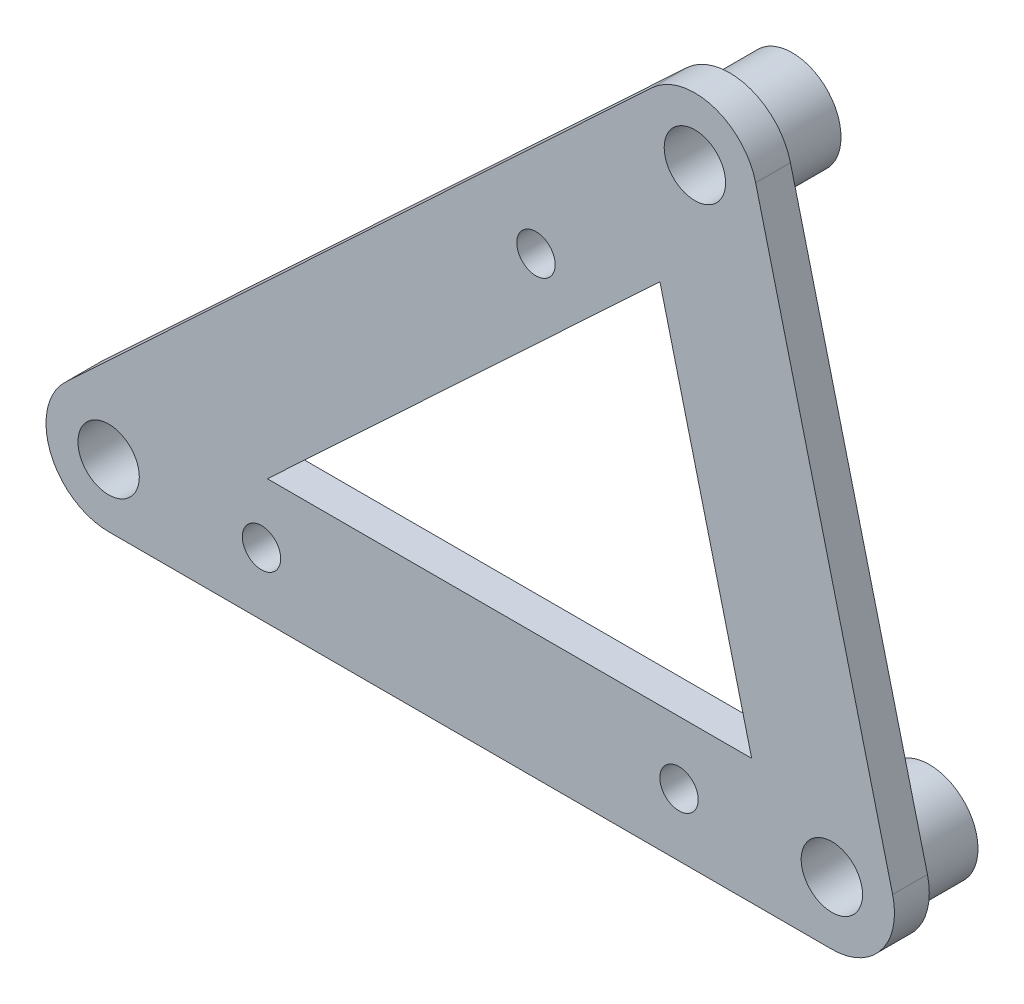
ISO-10303-21;
HEADER;
FILE_DESCRIPTION(('STEP AP214'),'2;1');
FILE_NAME('part.step','',(''),(''),'','','');
FILE_SCHEMA(('AUTOMOTIVE_DESIGN { 1 0 10303 214 1 1 1 1 }'));
ENDSEC;
DATA;
#1=APPLICATION_CONTEXT('core data for automotive mechanical design processes');
#2=APPLICATION_PROTOCOL_DEFINITION('international standard','automotive_design',2000,#1);
#3=PRODUCT_CONTEXT('',#1,'mechanical');
#4=PRODUCT('Part','Part','',(#3));
#5=PRODUCT_RELATED_PRODUCT_CATEGORY('part','',(#4));
#6=PRODUCT_DEFINITION_FORMATION('','',#4);
#7=PRODUCT_DEFINITION_CONTEXT('part definition',#1,'design');
#8=PRODUCT_DEFINITION('design','',#6,#7);
#9=PRODUCT_DEFINITION_SHAPE('','',#8);
#10=(LENGTH_UNIT() NAMED_UNIT(*) SI_UNIT(.MILLI.,.METRE.));
#11=(NAMED_UNIT(*) PLANE_ANGLE_UNIT() SI_UNIT($,.RADIAN.));
#12=(NAMED_UNIT(*) SI_UNIT($,.STERADIAN.) SOLID_ANGLE_UNIT());
#13=UNCERTAINTY_MEASURE_WITH_UNIT(LENGTH_MEASURE(1.E-05),#10,'distance_accuracy_value','');
#14=(GEOMETRIC_REPRESENTATION_CONTEXT(3) GLOBAL_UNCERTAINTY_ASSIGNED_CONTEXT((#13)) GLOBAL_UNIT_ASSIGNED_CONTEXT((#10,
#11,#12)) REPRESENTATION_CONTEXT('',''));
#15=CARTESIAN_POINT('',(0.,0.,0.));
#16=DIRECTION('',(0.,0.,1.));
#17=DIRECTION('',(1.,0.,0.));
#18=AXIS2_PLACEMENT_3D('',#15,#16,#17);
#19=CARTESIAN_POINT('',(-25.5,-59.5,5.715));
#20=DIRECTION('',(0.,0.,-1.));
#21=DIRECTION('',(-1.,0.,0.));
#22=AXIS2_PLACEMENT_3D('',#19,#20,#21);
#23=CYLINDRICAL_SURFACE('',#22,4.445);
#24=CARTESIAN_POINT('',(-25.5,-59.5,0.));
#25=DIRECTION('',(0.,0.,1.));
#26=DIRECTION('',(1.,0.,0.));
#27=AXIS2_PLACEMENT_3D('',#24,#25,#26);
#28=CIRCLE('',#27,4.445);
#29=CARTESIAN_POINT('',(-21.055,-59.5,0.));
#30=VERTEX_POINT('',#29);
#31=EDGE_CURVE('E44',#30,#30,#28,.T.);
#32=ORIENTED_EDGE('',*,*,#31,.T.);
#33=EDGE_LOOP('',(#32));
#34=FACE_BOUND('',#33,.T.);
#35=CARTESIAN_POINT('',(-25.5,-59.5,5.715));
#36=DIRECTION('',(0.,0.,1.));
#37=DIRECTION('',(1.,0.,0.));
#38=AXIS2_PLACEMENT_3D('',#35,#36,#37);
#39=CIRCLE('',#38,4.445);
#40=CARTESIAN_POINT('',(-21.055,-59.5,5.715));
#41=VERTEX_POINT('',#40);
#42=EDGE_CURVE('E11',#41,#41,#39,.T.);
#43=ORIENTED_EDGE('',*,*,#42,.F.);
#44=EDGE_LOOP('',(#43));
#45=FACE_BOUND('',#44,.T.);
#46=ADVANCED_FACE('F35',(#34,#45),#23,.T.);
#47=CARTESIAN_POINT('',(-25.5,-59.5,0.));
#48=DIRECTION('',(0.,0.,1.));
#49=DIRECTION('',(1.,0.,0.));
#50=AXIS2_PLACEMENT_3D('',#47,#48,#49);
#51=PLANE('',#50);
#52=ORIENTED_EDGE('',*,*,#31,.F.);
#53=EDGE_LOOP('',(#52));
#54=FACE_BOUND('',#53,.T.);
#55=CARTESIAN_POINT('',(-25.5,-59.5,0.));
#56=DIRECTION('',(0.,0.,1.));
#57=DIRECTION('',(1.,0.,0.));
#58=AXIS2_PLACEMENT_3D('',#55,#56,#57);
#59=CIRCLE('',#58,2.8);
#60=CARTESIAN_POINT('',(-22.7,-59.5,0.));
#61=VERTEX_POINT('',#60);
#62=EDGE_CURVE('E171',#61,#61,#59,.T.);
#63=ORIENTED_EDGE('',*,*,#62,.T.);
#64=EDGE_LOOP('',(#63));
#65=FACE_BOUND('',#64,.T.);
#66=ADVANCED_FACE('F258',(#54,#65),#51,.F.);
#67=CARTESIAN_POINT('',(-25.5,-59.5,5.715));
#68=DIRECTION('',(0.,0.,-1.));
#69=DIRECTION('',(-1.,0.,0.));
#70=AXIS2_PLACEMENT_3D('',#67,#68,#69);
#71=CYLINDRICAL_SURFACE('',#70,2.8);
#72=ORIENTED_EDGE('',*,*,#62,.F.);
#73=EDGE_LOOP('',(#72));
#74=FACE_BOUND('',#73,.T.);
#75=CARTESIAN_POINT('',(-25.5,-59.5,8.89));
#76=DIRECTION('',(0.,0.,1.));
#77=DIRECTION('',(1.,0.,0.));
#78=AXIS2_PLACEMENT_3D('',#75,#76,#77);
#79=CIRCLE('',#78,2.8);
#80=CARTESIAN_POINT('',(-22.7,-59.5,8.89));
#81=VERTEX_POINT('',#80);
#82=EDGE_CURVE('E168',#81,#81,#79,.F.);
#83=ORIENTED_EDGE('',*,*,#82,.F.);
#84=EDGE_LOOP('',(#83));
#85=FACE_BOUND('',#84,.T.);
#86=ADVANCED_FACE('F263',(#74,#85),#71,.F.);
#87=CARTESIAN_POINT('',(0.,0.,8.89));
#88=DIRECTION('',(0.,0.,1.));
#89=DIRECTION('',(1.,0.,0.));
#90=AXIS2_PLACEMENT_3D('',#87,#88,#89);
#91=PLANE('',#90);
#92=CARTESIAN_POINT('',(-52.5033669427895,-23.7458571377787,8.89));
#93=DIRECTION('',(0.,0.,-1.));
#94=DIRECTION('',(-1.,0.,0.));
#95=AXIS2_PLACEMENT_3D('',#92,#93,#94);
#96=CIRCLE('',#95,1.75000000000001);
#97=CARTESIAN_POINT('',(-54.2533669427896,-23.7458571377787,8.89));
#98=VERTEX_POINT('',#97);
#99=EDGE_CURVE('E188',#98,#98,#96,.T.);
#100=ORIENTED_EDGE('',*,*,#99,.T.);
#101=EDGE_LOOP('',(#100));
#102=FACE_BOUND('',#101,.T.);
#103=CARTESIAN_POINT('',(-77.55,-59.5,8.89));
#104=DIRECTION('',(0.,0.,1.));
#105=DIRECTION('',(1.,0.,0.));
#106=AXIS2_PLACEMENT_3D('',#103,#104,#105);
#107=CIRCLE('',#106,1.75);
#108=CARTESIAN_POINT('',(-75.8,-59.5,8.89));
#109=VERTEX_POINT('',#108);
#110=EDGE_CURVE('E177',#109,#109,#107,.T.);
#111=ORIENTED_EDGE('',*,*,#110,.F.);
#112=EDGE_LOOP('',(#111));
#113=FACE_BOUND('',#112,.T.);
#114=CARTESIAN_POINT('',(-39.45,-59.5,8.89));
#115=DIRECTION('',(0.,0.,1.));
#116=DIRECTION('',(1.,0.,0.));
#117=AXIS2_PLACEMENT_3D('',#114,#115,#116);
#118=CIRCLE('',#117,1.75);
#119=CARTESIAN_POINT('',(-37.7,-59.5,8.89));
#120=VERTEX_POINT('',#119);
#121=EDGE_CURVE('E183',#120,#120,#118,.T.);
#122=ORIENTED_EDGE('',*,*,#121,.F.);
#123=EDGE_LOOP('',(#122));
#124=FACE_BOUND('',#123,.T.);
#125=ORIENTED_EDGE('',*,*,#82,.T.);
#126=EDGE_LOOP('',(#125));
#127=FACE_BOUND('',#126,.T.);
#128=DIRECTION('',(-0.242535625036333,0.970142500145332,0.));
#129=VECTOR('',#128,1.);
#130=CARTESIAN_POINT('',(-43.5443643883306,-10.8860910970827,8.89));
#131=LINE('',#130,#129);
#132=CARTESIAN_POINT('',(-32.8196371626012,-53.785,8.89));
#133=VERTEX_POINT('',#132);
#134=CARTESIAN_POINT('',(-41.1899823642551,-20.3036191933847,8.89));
#135=VERTEX_POINT('',#134);
#136=EDGE_CURVE('E200',#133,#135,#131,.T.);
#137=ORIENTED_EDGE('',*,*,#136,.F.);
#138=DIRECTION('',(-1.,0.,0.));
#139=VECTOR('',#138,1.);
#140=CARTESIAN_POINT('',(0.,-53.785,8.89));
#141=LINE('',#140,#139);
#142=CARTESIAN_POINT('',(-77.0150598273334,-53.785,8.89));
#143=VERTEX_POINT('',#142);
#144=EDGE_CURVE('E202',#133,#143,#141,.T.);
#145=ORIENTED_EDGE('',*,*,#144,.T.);
#146=DIRECTION('',(-0.730600984463314,-0.68280465837693,0.));
#147=VECTOR('',#146,1.);
#148=CARTESIAN_POINT('',(-9.07506635616276,9.71032100109414,8.89));
#149=LINE('',#148,#147);
#150=EDGE_CURVE('E204',#135,#143,#149,.T.);
#151=ORIENTED_EDGE('',*,*,#150,.F.);
#152=EDGE_LOOP('',(#137,#145,#151));
#153=FACE_BOUND('',#152,.T.);
#154=DIRECTION('',(-1.,0.,0.));
#155=VECTOR('',#154,1.);
#156=CARTESIAN_POINT('',(0.,-65.215,8.89));
#157=LINE('',#156,#155);
#158=CARTESIAN_POINT('',(-25.5,-65.215,8.89));
#159=VERTEX_POINT('',#158);
#160=CARTESIAN_POINT('',(-91.5,-65.215,8.89));
#161=VERTEX_POINT('',#160);
#162=EDGE_CURVE('E207',#159,#161,#157,.T.);
#163=ORIENTED_EDGE('',*,*,#162,.F.);
#164=CARTESIAN_POINT('',(-25.5,-59.5,8.89));
#165=DIRECTION('',(0.,0.,1.));
#166=DIRECTION('',(1.,0.,0.));
#167=AXIS2_PLACEMENT_3D('',#164,#165,#166);
#168=CIRCLE('',#167,5.715);
#169=CARTESIAN_POINT('',(-19.9556356116694,-58.1139089029174,8.89));
#170=VERTEX_POINT('',#169);
#171=EDGE_CURVE('E209',#159,#170,#168,.T.);
#172=ORIENTED_EDGE('',*,*,#171,.T.);
#173=DIRECTION('',(-0.242535625036333,0.970142500145332,0.));
#174=VECTOR('',#173,1.);
#175=CARTESIAN_POINT('',(-32.4556356116694,-8.11390890291736,8.89));
#176=LINE('',#175,#174);
#177=CARTESIAN_POINT('',(-32.4556356116694,-8.11390890291735,8.89));
#178=VERTEX_POINT('',#177);
#179=EDGE_CURVE('E132',#170,#178,#176,.T.);
#180=ORIENTED_EDGE('',*,*,#179,.T.);
#181=CARTESIAN_POINT('',(-38.,-9.49999999999999,8.89));
#182=DIRECTION('',(0.,0.,1.));
#183=DIRECTION('',(1.,0.,0.));
#184=AXIS2_PLACEMENT_3D('',#181,#182,#183);
#185=CIRCLE('',#184,5.715);
#186=CARTESIAN_POINT('',(-41.9022286226242,-5.32461537379216,8.89));
#187=VERTEX_POINT('',#186);
#188=EDGE_CURVE('E126',#178,#187,#185,.T.);
#189=ORIENTED_EDGE('',*,*,#188,.T.);
#190=DIRECTION('',(-0.730600984463315,-0.682804658376929,0.));
#191=VECTOR('',#190,1.);
#192=CARTESIAN_POINT('',(-16.879523601411,18.0610902535098,8.89));
#193=LINE('',#192,#191);
#194=CARTESIAN_POINT('',(-95.4022286226241,-55.3246153737921,8.89));
#195=VERTEX_POINT('',#194);
#196=EDGE_CURVE('E118',#187,#195,#193,.T.);
#197=ORIENTED_EDGE('',*,*,#196,.T.);
#198=CARTESIAN_POINT('',(-91.5,-59.5,8.89));
#199=DIRECTION('',(0.,0.,1.));
#200=DIRECTION('',(1.,0.,0.));
#201=AXIS2_PLACEMENT_3D('',#198,#199,#200);
#202=CIRCLE('',#201,5.71499999999999);
#203=EDGE_CURVE('E53',#195,#161,#202,.T.);
#204=ORIENTED_EDGE('',*,*,#203,.T.);
#205=EDGE_LOOP('',(#163,#172,#180,#189,#197,#204));
#206=FACE_BOUND('',#205,.T.);
#207=CARTESIAN_POINT('',(-38.,-9.49999999999999,8.89));
#208=DIRECTION('',(0.,0.,1.));
#209=DIRECTION('',(1.,0.,0.));
#210=AXIS2_PLACEMENT_3D('',#207,#208,#209);
#211=CIRCLE('',#210,2.8);
#212=CARTESIAN_POINT('',(-40.8,-9.49999999999999,8.89));
#213=VERTEX_POINT('',#212);
#214=EDGE_CURVE('E213',#213,#213,#211,.T.);
#215=ORIENTED_EDGE('',*,*,#214,.F.);
#216=EDGE_LOOP('',(#215));
#217=FACE_BOUND('',#216,.T.);
#218=CARTESIAN_POINT('',(-91.5,-59.5,8.89));
#219=DIRECTION('',(0.,0.,1.));
#220=DIRECTION('',(1.,0.,0.));
#221=AXIS2_PLACEMENT_3D('',#218,#219,#220);
#222=CIRCLE('',#221,2.8);
#223=CARTESIAN_POINT('',(-88.7,-59.5,8.89));
#224=VERTEX_POINT('',#223);
#225=EDGE_CURVE('E154',#224,#224,#222,.T.);
#226=ORIENTED_EDGE('',*,*,#225,.F.);
#227=EDGE_LOOP('',(#226));
#228=FACE_BOUND('',#227,.T.);
#229=ADVANCED_FACE('F129',(#102,#113,#124,#127,#153,#206,#217,#228),#91,.T.);
#230=CARTESIAN_POINT('',(0.,0.,5.715));
#231=DIRECTION('',(0.,0.,1.));
#232=DIRECTION('',(1.,0.,0.));
#233=AXIS2_PLACEMENT_3D('',#230,#231,#232);
#234=PLANE('',#233);
#235=CARTESIAN_POINT('',(-52.5033669427895,-23.7458571377787,5.715));
#236=DIRECTION('',(0.,0.,-1.));
#237=DIRECTION('',(-1.,0.,0.));
#238=AXIS2_PLACEMENT_3D('',#235,#236,#237);
#239=CIRCLE('',#238,1.75000000000001);
#240=CARTESIAN_POINT('',(-54.2533669427896,-23.7458571377787,5.715));
#241=VERTEX_POINT('',#240);
#242=EDGE_CURVE('E191',#241,#241,#239,.T.);
#243=ORIENTED_EDGE('',*,*,#242,.F.);
#244=EDGE_LOOP('',(#243));
#245=FACE_BOUND('',#244,.T.);
#246=CARTESIAN_POINT('',(-77.55,-59.5,5.715));
#247=DIRECTION('',(0.,0.,1.));
#248=DIRECTION('',(1.,0.,0.));
#249=AXIS2_PLACEMENT_3D('',#246,#247,#248);
#250=CIRCLE('',#249,1.75);
#251=CARTESIAN_POINT('',(-75.8,-59.5,5.715));
#252=VERTEX_POINT('',#251);
#253=EDGE_CURVE('E38',#252,#252,#250,.T.);
#254=ORIENTED_EDGE('',*,*,#253,.T.);
#255=EDGE_LOOP('',(#254));
#256=FACE_BOUND('',#255,.T.);
#257=CARTESIAN_POINT('',(-39.45,-59.5,5.715));
#258=DIRECTION('',(0.,0.,1.));
#259=DIRECTION('',(1.,0.,0.));
#260=AXIS2_PLACEMENT_3D('',#257,#258,#259);
#261=CIRCLE('',#260,1.75);
#262=CARTESIAN_POINT('',(-37.7,-59.5,5.715));
#263=VERTEX_POINT('',#262);
#264=EDGE_CURVE('E175',#263,#263,#261,.T.);
#265=ORIENTED_EDGE('',*,*,#264,.T.);
#266=EDGE_LOOP('',(#265));
#267=FACE_BOUND('',#266,.T.);
#268=ORIENTED_EDGE('',*,*,#42,.T.);
#269=EDGE_LOOP('',(#268));
#270=FACE_BOUND('',#269,.T.);
#271=DIRECTION('',(-1.,0.,0.));
#272=VECTOR('',#271,1.);
#273=CARTESIAN_POINT('',(0.,-65.215,5.715));
#274=LINE('',#273,#272);
#275=CARTESIAN_POINT('',(-25.5,-65.215,5.715));
#276=VERTEX_POINT('',#275);
#277=CARTESIAN_POINT('',(-91.5,-65.215,5.715));
#278=VERTEX_POINT('',#277);
#279=EDGE_CURVE('E226',#276,#278,#274,.T.);
#280=ORIENTED_EDGE('',*,*,#279,.T.);
#281=CARTESIAN_POINT('',(-91.5,-59.5,5.715));
#282=DIRECTION('',(0.,0.,1.));
#283=DIRECTION('',(1.,0.,0.));
#284=AXIS2_PLACEMENT_3D('',#281,#282,#283);
#285=CIRCLE('',#284,5.71499999999999);
#286=CARTESIAN_POINT('',(-95.4022286226241,-55.3246153737921,5.715));
#287=VERTEX_POINT('',#286);
#288=EDGE_CURVE('E84',#287,#278,#285,.T.);
#289=ORIENTED_EDGE('',*,*,#288,.F.);
#290=DIRECTION('',(-0.730600984463315,-0.682804658376929,0.));
#291=VECTOR('',#290,1.);
#292=CARTESIAN_POINT('',(-16.879523601411,18.0610902535098,5.715));
#293=LINE('',#292,#291);
#294=CARTESIAN_POINT('',(-41.9022286226242,-5.32461537379216,5.715));
#295=VERTEX_POINT('',#294);
#296=EDGE_CURVE('E235',#295,#287,#293,.T.);
#297=ORIENTED_EDGE('',*,*,#296,.F.);
#298=CARTESIAN_POINT('',(-38.,-9.49999999999999,5.715));
#299=DIRECTION('',(0.,0.,1.));
#300=DIRECTION('',(1.,0.,0.));
#301=AXIS2_PLACEMENT_3D('',#298,#299,#300);
#302=CIRCLE('',#301,5.715);
#303=CARTESIAN_POINT('',(-32.4556356116694,-8.11390890291735,5.715));
#304=VERTEX_POINT('',#303);
#305=EDGE_CURVE('E138',#304,#295,#302,.T.);
#306=ORIENTED_EDGE('',*,*,#305,.F.);
#307=DIRECTION('',(-0.242535625036333,0.970142500145332,0.));
#308=VECTOR('',#307,1.);
#309=CARTESIAN_POINT('',(-32.4556356116694,-8.11390890291736,5.715));
#310=LINE('',#309,#308);
#311=CARTESIAN_POINT('',(-19.9556356116694,-58.1139089029174,5.715));
#312=VERTEX_POINT('',#311);
#313=EDGE_CURVE('E231',#312,#304,#310,.T.);
#314=ORIENTED_EDGE('',*,*,#313,.F.);
#315=CARTESIAN_POINT('',(-25.5,-59.5,5.715));
#316=DIRECTION('',(0.,0.,1.));
#317=DIRECTION('',(1.,0.,0.));
#318=AXIS2_PLACEMENT_3D('',#315,#316,#317);
#319=CIRCLE('',#318,5.715);
#320=EDGE_CURVE('E228',#276,#312,#319,.T.);
#321=ORIENTED_EDGE('',*,*,#320,.F.);
#322=EDGE_LOOP('',(#280,#289,#297,#306,#314,#321));
#323=FACE_BOUND('',#322,.T.);
#324=DIRECTION('',(-0.242535625036333,0.970142500145332,0.));
#325=VECTOR('',#324,1.);
#326=CARTESIAN_POINT('',(-43.5443643883306,-10.8860910970827,5.715));
#327=LINE('',#326,#325);
#328=CARTESIAN_POINT('',(-32.8196371626012,-53.785,5.715));
#329=VERTEX_POINT('',#328);
#330=CARTESIAN_POINT('',(-41.1899823642551,-20.3036191933847,5.715));
#331=VERTEX_POINT('',#330);
#332=EDGE_CURVE('E199',#329,#331,#327,.T.);
#333=ORIENTED_EDGE('',*,*,#332,.T.);
#334=DIRECTION('',(-0.730600984463314,-0.68280465837693,0.));
#335=VECTOR('',#334,1.);
#336=CARTESIAN_POINT('',(-9.07506635616276,9.71032100109414,5.715));
#337=LINE('',#336,#335);
#338=CARTESIAN_POINT('',(-77.0150598273334,-53.785,5.715));
#339=VERTEX_POINT('',#338);
#340=EDGE_CURVE('E223',#331,#339,#337,.T.);
#341=ORIENTED_EDGE('',*,*,#340,.T.);
#342=DIRECTION('',(-1.,0.,0.));
#343=VECTOR('',#342,1.);
#344=CARTESIAN_POINT('',(0.,-53.785,5.715));
#345=LINE('',#344,#343);
#346=EDGE_CURVE('E220',#329,#339,#345,.T.);
#347=ORIENTED_EDGE('',*,*,#346,.F.);
#348=EDGE_LOOP('',(#333,#341,#347));
#349=FACE_BOUND('',#348,.T.);
#350=CARTESIAN_POINT('',(-91.5,-59.5,5.715));
#351=DIRECTION('',(0.,0.,1.));
#352=DIRECTION('',(1.,0.,0.));
#353=AXIS2_PLACEMENT_3D('',#350,#351,#352);
#354=CIRCLE('',#353,4.445);
#355=CARTESIAN_POINT('',(-87.055,-59.5,5.715));
#356=VERTEX_POINT('',#355);
#357=EDGE_CURVE('E160',#356,#356,#354,.T.);
#358=ORIENTED_EDGE('',*,*,#357,.T.);
#359=EDGE_LOOP('',(#358));
#360=FACE_BOUND('',#359,.T.);
#361=CARTESIAN_POINT('',(-38.,-9.49999999999999,5.715));
#362=DIRECTION('',(0.,0.,1.));
#363=DIRECTION('',(1.,0.,0.));
#364=AXIS2_PLACEMENT_3D('',#361,#362,#363);
#365=CIRCLE('',#364,4.445);
#366=CARTESIAN_POINT('',(-33.555,-9.49999999999999,5.715));
#367=VERTEX_POINT('',#366);
#368=EDGE_CURVE('E163',#367,#367,#365,.F.);
#369=ORIENTED_EDGE('',*,*,#368,.F.);
#370=EDGE_LOOP('',(#369));
#371=FACE_BOUND('',#370,.T.);
#372=ADVANCED_FACE('F240',(#245,#256,#267,#270,#323,#349,#360,#371),#234,.F.);
#373=CARTESIAN_POINT('',(-91.5,-59.5,0.));
#374=DIRECTION('',(0.,0.,1.));
#375=DIRECTION('',(1.,0.,0.));
#376=AXIS2_PLACEMENT_3D('',#373,#374,#375);
#377=PLANE('',#376);
#378=CARTESIAN_POINT('',(-91.5,-59.5,0.));
#379=DIRECTION('',(0.,0.,1.));
#380=DIRECTION('',(1.,0.,0.));
#381=AXIS2_PLACEMENT_3D('',#378,#379,#380);
#382=CIRCLE('',#381,4.445);
#383=CARTESIAN_POINT('',(-87.055,-59.5,0.));
#384=VERTEX_POINT('',#383);
#385=EDGE_CURVE('E159',#384,#384,#382,.T.);
#386=ORIENTED_EDGE('',*,*,#385,.F.);
#387=EDGE_LOOP('',(#386));
#388=FACE_BOUND('',#387,.T.);
#389=CARTESIAN_POINT('',(-91.5,-59.5,0.));
#390=DIRECTION('',(0.,0.,1.));
#391=DIRECTION('',(1.,0.,0.));
#392=AXIS2_PLACEMENT_3D('',#389,#390,#391);
#393=CIRCLE('',#392,2.79999999999999);
#394=CARTESIAN_POINT('',(-88.7,-59.5,0.));
#395=VERTEX_POINT('',#394);
#396=EDGE_CURVE('E150',#395,#395,#393,.T.);
#397=ORIENTED_EDGE('',*,*,#396,.T.);
#398=EDGE_LOOP('',(#397));
#399=FACE_BOUND('',#398,.T.);
#400=ADVANCED_FACE('F270',(#388,#399),#377,.F.);
#401=CARTESIAN_POINT('',(-91.5,-59.5,5.715));
#402=DIRECTION('',(0.,0.,-1.));
#403=DIRECTION('',(-1.,0.,0.));
#404=AXIS2_PLACEMENT_3D('',#401,#402,#403);
#405=CYLINDRICAL_SURFACE('',#404,4.445);
#406=ORIENTED_EDGE('',*,*,#357,.F.);
#407=EDGE_LOOP('',(#406));
#408=FACE_BOUND('',#407,.T.);
#409=ORIENTED_EDGE('',*,*,#385,.T.);
#410=EDGE_LOOP('',(#409));
#411=FACE_BOUND('',#410,.T.);
#412=ADVANCED_FACE('F278',(#408,#411),#405,.T.);
#413=CARTESIAN_POINT('',(-91.5,-59.5,5.715));
#414=DIRECTION('',(0.,0.,-1.));
#415=DIRECTION('',(-1.,0.,0.));
#416=AXIS2_PLACEMENT_3D('',#413,#414,#415);
#417=CYLINDRICAL_SURFACE('',#416,2.79999999999999);
#418=ORIENTED_EDGE('',*,*,#396,.F.);
#419=EDGE_LOOP('',(#418));
#420=FACE_BOUND('',#419,.T.);
#421=ORIENTED_EDGE('',*,*,#225,.T.);
#422=EDGE_LOOP('',(#421));
#423=FACE_BOUND('',#422,.T.);
#424=ADVANCED_FACE('F310',(#420,#423),#417,.F.);
#425=CARTESIAN_POINT('',(0.,-65.215,8.89));
#426=DIRECTION('',(0.,-1.,0.));
#427=DIRECTION('',(0.,0.,-1.));
#428=AXIS2_PLACEMENT_3D('',#425,#426,#427);
#429=PLANE('',#428);
#430=ORIENTED_EDGE('',*,*,#279,.F.);
#431=DIRECTION('',(0.,0.,-1.));
#432=VECTOR('',#431,1.);
#433=CARTESIAN_POINT('',(-25.5,-65.215,8.89));
#434=LINE('',#433,#432);
#435=EDGE_CURVE('E148',#159,#276,#434,.T.);
#436=ORIENTED_EDGE('',*,*,#435,.F.);
#437=ORIENTED_EDGE('',*,*,#162,.T.);
#438=DIRECTION('',(0.,0.,-1.));
#439=VECTOR('',#438,1.);
#440=CARTESIAN_POINT('',(-91.5,-65.215,8.89));
#441=LINE('',#440,#439);
#442=EDGE_CURVE('E91',#161,#278,#441,.T.);
#443=ORIENTED_EDGE('',*,*,#442,.T.);
#444=EDGE_LOOP('',(#430,#436,#437,#443));
#445=FACE_BOUND('',#444,.T.);
#446=ADVANCED_FACE('F242',(#445),#429,.T.);
#447=CARTESIAN_POINT('',(-25.5,-59.5,8.89));
#448=DIRECTION('',(0.,0.,-1.));
#449=DIRECTION('',(-1.,0.,0.));
#450=AXIS2_PLACEMENT_3D('',#447,#448,#449);
#451=CYLINDRICAL_SURFACE('',#450,5.715);
#452=ORIENTED_EDGE('',*,*,#320,.T.);
#453=DIRECTION('',(0.,0.,-1.));
#454=VECTOR('',#453,1.);
#455=CARTESIAN_POINT('',(-19.9556356116694,-58.1139089029174,8.89));
#456=LINE('',#455,#454);
#457=EDGE_CURVE('E141',#170,#312,#456,.T.);
#458=ORIENTED_EDGE('',*,*,#457,.F.);
#459=ORIENTED_EDGE('',*,*,#171,.F.);
#460=ORIENTED_EDGE('',*,*,#435,.T.);
#461=EDGE_LOOP('',(#452,#458,#459,#460));
#462=FACE_BOUND('',#461,.T.);
#463=ADVANCED_FACE('F246',(#462),#451,.T.);
#464=CARTESIAN_POINT('',(-32.4556356116694,-8.11390890291736,8.89));
#465=DIRECTION('',(-0.970142500145332,-0.242535625036333,0.));
#466=DIRECTION('',(0.242535625036333,-0.970142500145332,0.));
#467=AXIS2_PLACEMENT_3D('',#464,#465,#466);
#468=PLANE('',#467);
#469=ORIENTED_EDGE('',*,*,#313,.T.);
#470=DIRECTION('',(0.,0.,-1.));
#471=VECTOR('',#470,1.);
#472=CARTESIAN_POINT('',(-32.4556356116694,-8.11390890291735,8.89));
#473=LINE('',#472,#471);
#474=EDGE_CURVE('E139',#178,#304,#473,.T.);
#475=ORIENTED_EDGE('',*,*,#474,.F.);
#476=ORIENTED_EDGE('',*,*,#179,.F.);
#477=ORIENTED_EDGE('',*,*,#457,.T.);
#478=EDGE_LOOP('',(#469,#475,#476,#477));
#479=FACE_BOUND('',#478,.T.);
#480=ADVANCED_FACE('F248',(#479),#468,.F.);
#481=CARTESIAN_POINT('',(-38.,-9.49999999999999,8.89));
#482=DIRECTION('',(0.,0.,-1.));
#483=DIRECTION('',(-1.,0.,0.));
#484=AXIS2_PLACEMENT_3D('',#481,#482,#483);
#485=CYLINDRICAL_SURFACE('',#484,5.715);
#486=ORIENTED_EDGE('',*,*,#305,.T.);
#487=DIRECTION('',(0.,0.,-1.));
#488=VECTOR('',#487,1.);
#489=CARTESIAN_POINT('',(-41.9022286226242,-5.32461537379216,8.89));
#490=LINE('',#489,#488);
#491=EDGE_CURVE('E123',#187,#295,#490,.T.);
#492=ORIENTED_EDGE('',*,*,#491,.F.);
#493=ORIENTED_EDGE('',*,*,#188,.F.);
#494=ORIENTED_EDGE('',*,*,#474,.T.);
#495=EDGE_LOOP('',(#486,#492,#493,#494));
#496=FACE_BOUND('',#495,.T.);
#497=ADVANCED_FACE('F137',(#496),#485,.T.);
#498=CARTESIAN_POINT('',(-16.879523601411,18.0610902535098,8.89));
#499=DIRECTION('',(0.682804658376929,-0.730600984463315,0.));
#500=DIRECTION('',(0.730600984463315,0.682804658376929,0.));
#501=AXIS2_PLACEMENT_3D('',#498,#499,#500);
#502=PLANE('',#501);
#503=ORIENTED_EDGE('',*,*,#296,.T.);
#504=DIRECTION('',(0.,0.,-1.));
#505=VECTOR('',#504,1.);
#506=CARTESIAN_POINT('',(-95.4022286226241,-55.3246153737921,8.89));
#507=LINE('',#506,#505);
#508=EDGE_CURVE('E125',#195,#287,#507,.T.);
#509=ORIENTED_EDGE('',*,*,#508,.F.);
#510=ORIENTED_EDGE('',*,*,#196,.F.);
#511=ORIENTED_EDGE('',*,*,#491,.T.);
#512=EDGE_LOOP('',(#503,#509,#510,#511));
#513=FACE_BOUND('',#512,.T.);
#514=ADVANCED_FACE('F121',(#513),#502,.F.);
#515=CARTESIAN_POINT('',(-43.5443643883306,-10.8860910970827,8.89));
#516=DIRECTION('',(-0.970142500145332,-0.242535625036333,0.));
#517=DIRECTION('',(0.242535625036333,-0.970142500145332,0.));
#518=AXIS2_PLACEMENT_3D('',#515,#516,#517);
#519=PLANE('',#518);
#520=ORIENTED_EDGE('',*,*,#332,.F.);
#521=DIRECTION('',(0.,0.,-1.));
#522=VECTOR('',#521,1.);
#523=CARTESIAN_POINT('',(-32.8196371626012,-53.785,8.89));
#524=LINE('',#523,#522);
#525=EDGE_CURVE('E98',#133,#329,#524,.T.);
#526=ORIENTED_EDGE('',*,*,#525,.F.);
#527=ORIENTED_EDGE('',*,*,#136,.T.);
#528=DIRECTION('',(0.,0.,-1.));
#529=VECTOR('',#528,1.);
#530=CARTESIAN_POINT('',(-41.1899823642551,-20.3036191933847,8.89));
#531=LINE('',#530,#529);
#532=EDGE_CURVE('E151',#135,#331,#531,.T.);
#533=ORIENTED_EDGE('',*,*,#532,.T.);
#534=EDGE_LOOP('',(#520,#526,#527,#533));
#535=FACE_BOUND('',#534,.T.);
#536=ADVANCED_FACE('F298',(#535),#519,.T.);
#537=CARTESIAN_POINT('',(0.,-53.785,8.89));
#538=DIRECTION('',(0.,-1.,0.));
#539=DIRECTION('',(1.,0.,0.));
#540=AXIS2_PLACEMENT_3D('',#537,#538,#539);
#541=PLANE('',#540);
#542=ORIENTED_EDGE('',*,*,#346,.T.);
#543=DIRECTION('',(0.,0.,-1.));
#544=VECTOR('',#543,1.);
#545=CARTESIAN_POINT('',(-77.0150598273334,-53.785,8.89));
#546=LINE('',#545,#544);
#547=EDGE_CURVE('E153',#143,#339,#546,.T.);
#548=ORIENTED_EDGE('',*,*,#547,.F.);
#549=ORIENTED_EDGE('',*,*,#144,.F.);
#550=ORIENTED_EDGE('',*,*,#525,.T.);
#551=EDGE_LOOP('',(#542,#548,#549,#550));
#552=FACE_BOUND('',#551,.T.);
#553=ADVANCED_FACE('F292',(#552),#541,.F.);
#554=CARTESIAN_POINT('',(-38.,-9.49999999999999,8.89));
#555=DIRECTION('',(0.,0.,-1.));
#556=DIRECTION('',(-1.,0.,0.));
#557=AXIS2_PLACEMENT_3D('',#554,#555,#556);
#558=CYLINDRICAL_SURFACE('',#557,2.8);
#559=CARTESIAN_POINT('',(-38.,-9.49999999999999,0.));
#560=DIRECTION('',(0.,0.,1.));
#561=DIRECTION('',(1.,0.,0.));
#562=AXIS2_PLACEMENT_3D('',#559,#560,#561);
#563=CIRCLE('',#562,2.8);
#564=CARTESIAN_POINT('',(-40.8,-9.49999999999999,0.));
#565=VERTEX_POINT('',#564);
#566=EDGE_CURVE('E181',#565,#565,#563,.T.);
#567=CARTESIAN_POINT('',(-40.8,-9.49999999999999,8.89));
#568=CARTESIAN_POINT('',(-40.8,-9.49999999999999,8.79739583333333));
#569=CARTESIAN_POINT('',(-40.8,-9.49999999999999,8.70479166666667));
#570=CARTESIAN_POINT('',(-40.8,-9.49999999999999,8.51958333333333));
#571=CARTESIAN_POINT('',(-40.8,-9.49999999999999,8.42697916666667));
#572=CARTESIAN_POINT('',(-40.8,-9.49999999999999,8.24177083333333));
#573=CARTESIAN_POINT('',(-40.8,-9.49999999999999,8.14916666666667));
#574=CARTESIAN_POINT('',(-40.8,-9.49999999999999,7.96395833333333));
#575=CARTESIAN_POINT('',(-40.8,-9.49999999999999,7.87135416666667));
#576=CARTESIAN_POINT('',(-40.8,-9.49999999999999,7.68614583333333));
#577=CARTESIAN_POINT('',(-40.8,-9.49999999999999,7.59354166666667));
#578=CARTESIAN_POINT('',(-40.8,-9.49999999999999,7.40833333333333));
#579=CARTESIAN_POINT('',(-40.8,-9.49999999999999,7.31572916666667));
#580=CARTESIAN_POINT('',(-40.8,-9.49999999999999,7.13052083333333));
#581=CARTESIAN_POINT('',(-40.8,-9.49999999999999,7.03791666666667));
#582=CARTESIAN_POINT('',(-40.8,-9.49999999999999,6.85270833333333));
#583=CARTESIAN_POINT('',(-40.8,-9.49999999999999,6.76010416666667));
#584=CARTESIAN_POINT('',(-40.8,-9.49999999999999,6.57489583333333));
#585=CARTESIAN_POINT('',(-40.8,-9.49999999999999,6.48229166666667));
#586=CARTESIAN_POINT('',(-40.8,-9.49999999999999,6.29708333333333));
#587=CARTESIAN_POINT('',(-40.8,-9.49999999999999,6.20447916666667));
#588=CARTESIAN_POINT('',(-40.8,-9.49999999999999,6.01927083333333));
#589=CARTESIAN_POINT('',(-40.8,-9.49999999999999,5.92666666666667));
#590=CARTESIAN_POINT('',(-40.8,-9.49999999999999,5.74145833333333));
#591=CARTESIAN_POINT('',(-40.8,-9.49999999999999,5.64885416666667));
#592=CARTESIAN_POINT('',(-40.8,-9.49999999999999,5.46364583333333));
#593=CARTESIAN_POINT('',(-40.8,-9.49999999999999,5.37104166666667));
#594=CARTESIAN_POINT('',(-40.8,-9.49999999999999,5.18583333333333));
#595=CARTESIAN_POINT('',(-40.8,-9.49999999999999,5.09322916666667));
#596=CARTESIAN_POINT('',(-40.8,-9.49999999999999,4.90802083333333));
#597=CARTESIAN_POINT('',(-40.8,-9.49999999999999,4.81541666666667));
#598=CARTESIAN_POINT('',(-40.8,-9.49999999999999,4.63020833333333));
#599=CARTESIAN_POINT('',(-40.8,-9.49999999999999,4.53760416666667));
#600=CARTESIAN_POINT('',(-40.8,-9.49999999999999,4.35239583333333));
#601=CARTESIAN_POINT('',(-40.8,-9.49999999999999,4.25979166666667));
#602=CARTESIAN_POINT('',(-40.8,-9.49999999999999,4.07458333333333));
#603=CARTESIAN_POINT('',(-40.8,-9.49999999999999,3.98197916666667));
#604=CARTESIAN_POINT('',(-40.8,-9.49999999999999,3.79677083333333));
#605=CARTESIAN_POINT('',(-40.8,-9.49999999999999,3.70416666666667));
#606=CARTESIAN_POINT('',(-40.8,-9.49999999999999,3.51895833333333));
#607=CARTESIAN_POINT('',(-40.8,-9.49999999999999,3.42635416666667));
#608=CARTESIAN_POINT('',(-40.8,-9.49999999999999,3.24114583333333));
#609=CARTESIAN_POINT('',(-40.8,-9.49999999999999,3.14854166666667));
#610=CARTESIAN_POINT('',(-40.8,-9.49999999999999,2.96333333333333));
#611=CARTESIAN_POINT('',(-40.8,-9.49999999999999,2.87072916666667));
#612=CARTESIAN_POINT('',(-40.8,-9.49999999999999,2.68552083333333));
#613=CARTESIAN_POINT('',(-40.8,-9.49999999999999,2.59291666666667));
#614=CARTESIAN_POINT('',(-40.8,-9.49999999999999,2.40770833333333));
#615=CARTESIAN_POINT('',(-40.8,-9.49999999999999,2.31510416666667));
#616=CARTESIAN_POINT('',(-40.8,-9.49999999999999,2.12989583333333));
#617=CARTESIAN_POINT('',(-40.8,-9.49999999999999,2.03729166666667));
#618=CARTESIAN_POINT('',(-40.8,-9.49999999999999,1.85208333333333));
#619=CARTESIAN_POINT('',(-40.8,-9.49999999999999,1.75947916666667));
#620=CARTESIAN_POINT('',(-40.8,-9.49999999999999,1.57427083333333));
#621=CARTESIAN_POINT('',(-40.8,-9.49999999999999,1.48166666666667));
#622=CARTESIAN_POINT('',(-40.8,-9.49999999999999,1.29645833333333));
#623=CARTESIAN_POINT('',(-40.8,-9.49999999999999,1.20385416666667));
#624=CARTESIAN_POINT('',(-40.8,-9.49999999999999,1.01864583333333));
#625=CARTESIAN_POINT('',(-40.8,-9.49999999999999,0.926041666666667));
#626=CARTESIAN_POINT('',(-40.8,-9.49999999999999,0.740833333333334));
#627=CARTESIAN_POINT('',(-40.8,-9.49999999999999,0.648229166666667));
#628=CARTESIAN_POINT('',(-40.8,-9.49999999999999,0.463020833333334));
#629=CARTESIAN_POINT('',(-40.8,-9.49999999999999,0.370416666666667));
#630=CARTESIAN_POINT('',(-40.8,-9.49999999999999,0.185208333333334));
#631=CARTESIAN_POINT('',(-40.8,-9.49999999999999,0.0926041666666669));
#632=CARTESIAN_POINT('',(-40.8,-9.49999999999999,0.));
#633=B_SPLINE_CURVE_WITH_KNOTS('',3,(#567,#568,#569,#570,#571,#572,#573,#574,#575,#576,#577,
#578,#579,#580,#581,#582,#583,#584,#585,#586,#587,#588,#589,#590,#591,#592,#593,#594,#595,#596,
#597,#598,#599,#600,#601,#602,#603,#604,#605,#606,#607,#608,#609,#610,#611,#612,#613,#614,#615,
#616,#617,#618,#619,#620,#621,#622,#623,#624,#625,#626,#627,#628,#629,#630,#631,#632),
.UNSPECIFIED.,.F.,.F.,(4,2,2,2,2,2,2,2,2,2,2,2,2,2,2,2,2,2,2,2,2,2,2,2,2,2,2,2,2,2,2,2,4),(0.,
0.2778125,0.555625000000001,0.833437500000001,1.11125,1.3890625,1.666875,1.9446875,2.2225,
2.5003125,2.778125,3.0559375,3.33375,3.6115625,3.889375,4.1671875,4.445,4.7228125,5.000625,
5.2784375,5.55625,5.8340625,6.111875,6.3896875,6.6675,6.9453125,7.223125,7.5009375,7.77875,
8.0565625,8.334375,8.6121875,8.89),.UNSPECIFIED.);
#634=EDGE_CURVE('BSEAM289',#213,#565,#633,.T.);
#635=ORIENTED_EDGE('',*,*,#214,.T.);
#636=ORIENTED_EDGE('',*,*,#566,.F.);
#637=ORIENTED_EDGE('',*,*,#634,.T.);
#638=ORIENTED_EDGE('',*,*,#634,.F.);
#639=EDGE_LOOP('',(#635,#637,#636,#638));
#640=FACE_BOUND('',#639,.T.);
#641=ADVANCED_FACE('F289',(#640),#558,.F.);
#642=CARTESIAN_POINT('',(-91.5,-59.5,8.89));
#643=DIRECTION('',(0.,0.,-1.));
#644=DIRECTION('',(-1.,0.,0.));
#645=AXIS2_PLACEMENT_3D('',#642,#643,#644);
#646=CYLINDRICAL_SURFACE('',#645,5.71499999999999);
#647=ORIENTED_EDGE('',*,*,#288,.T.);
#648=ORIENTED_EDGE('',*,*,#442,.F.);
#649=ORIENTED_EDGE('',*,*,#203,.F.);
#650=ORIENTED_EDGE('',*,*,#508,.T.);
#651=EDGE_LOOP('',(#647,#648,#649,#650));
#652=FACE_BOUND('',#651,.T.);
#653=ADVANCED_FACE('F238',(#652),#646,.T.);
#654=CARTESIAN_POINT('',(-9.07506635616276,9.71032100109414,8.89));
#655=DIRECTION('',(0.68280465837693,-0.730600984463314,0.));
#656=DIRECTION('',(0.730600984463314,0.68280465837693,0.));
#657=AXIS2_PLACEMENT_3D('',#654,#655,#656);
#658=PLANE('',#657);
#659=ORIENTED_EDGE('',*,*,#340,.F.);
#660=ORIENTED_EDGE('',*,*,#532,.F.);
#661=ORIENTED_EDGE('',*,*,#150,.T.);
#662=ORIENTED_EDGE('',*,*,#547,.T.);
#663=EDGE_LOOP('',(#659,#660,#661,#662));
#664=FACE_BOUND('',#663,.T.);
#665=ADVANCED_FACE('F296',(#664),#658,.T.);
#666=CARTESIAN_POINT('',(-38.,-9.49999999999999,0.));
#667=DIRECTION('',(0.,0.,1.));
#668=DIRECTION('',(1.,0.,0.));
#669=AXIS2_PLACEMENT_3D('',#666,#667,#668);
#670=PLANE('',#669);
#671=CARTESIAN_POINT('',(-38.,-9.49999999999999,0.));
#672=DIRECTION('',(0.,0.,1.));
#673=DIRECTION('',(1.,0.,0.));
#674=AXIS2_PLACEMENT_3D('',#671,#672,#673);
#675=CIRCLE('',#674,4.445);
#676=CARTESIAN_POINT('',(-33.555,-9.49999999999999,0.));
#677=VERTEX_POINT('',#676);
#678=EDGE_CURVE('E196',#677,#677,#675,.T.);
#679=ORIENTED_EDGE('',*,*,#678,.F.);
#680=EDGE_LOOP('',(#679));
#681=FACE_BOUND('',#680,.T.);
#682=ORIENTED_EDGE('',*,*,#566,.T.);
#683=EDGE_LOOP('',(#682));
#684=FACE_BOUND('',#683,.T.);
#685=ADVANCED_FACE('F335',(#681,#684),#670,.F.);
#686=CARTESIAN_POINT('',(-38.,-9.49999999999999,5.715));
#687=DIRECTION('',(0.,0.,-1.));
#688=DIRECTION('',(-1.,0.,0.));
#689=AXIS2_PLACEMENT_3D('',#686,#687,#688);
#690=CYLINDRICAL_SURFACE('',#689,4.445);
#691=ORIENTED_EDGE('',*,*,#368,.T.);
#692=EDGE_LOOP('',(#691));
#693=FACE_BOUND('',#692,.T.);
#694=ORIENTED_EDGE('',*,*,#678,.T.);
#695=EDGE_LOOP('',(#694));
#696=FACE_BOUND('',#695,.T.);
#697=ADVANCED_FACE('F287',(#693,#696),#690,.T.);
#698=CARTESIAN_POINT('',(-39.45,-59.5,3.81));
#699=DIRECTION('',(0.,0.,1.));
#700=DIRECTION('',(1.,0.,0.));
#701=AXIS2_PLACEMENT_3D('',#698,#699,#700);
#702=CYLINDRICAL_SURFACE('',#701,1.75);
#703=ORIENTED_EDGE('',*,*,#121,.T.);
#704=EDGE_LOOP('',(#703));
#705=FACE_BOUND('',#704,.T.);
#706=ORIENTED_EDGE('',*,*,#264,.F.);
#707=EDGE_LOOP('',(#706));
#708=FACE_BOUND('',#707,.T.);
#709=ADVANCED_FACE('F409',(#705,#708),#702,.F.);
#710=CARTESIAN_POINT('',(-77.55,-59.5,3.81));
#711=DIRECTION('',(0.,0.,1.));
#712=DIRECTION('',(1.,0.,0.));
#713=AXIS2_PLACEMENT_3D('',#710,#711,#712);
#714=CYLINDRICAL_SURFACE('',#713,1.75);
#715=ORIENTED_EDGE('',*,*,#110,.T.);
#716=EDGE_LOOP('',(#715));
#717=FACE_BOUND('',#716,.T.);
#718=ORIENTED_EDGE('',*,*,#253,.F.);
#719=EDGE_LOOP('',(#718));
#720=FACE_BOUND('',#719,.T.);
#721=ADVANCED_FACE('F419',(#717,#720),#714,.F.);
#722=CARTESIAN_POINT('',(-52.5033669427895,-23.7458571377787,8.89));
#723=DIRECTION('',(0.,0.,-1.));
#724=DIRECTION('',(-1.,0.,0.));
#725=AXIS2_PLACEMENT_3D('',#722,#723,#724);
#726=CYLINDRICAL_SURFACE('',#725,1.75000000000001);
#727=ORIENTED_EDGE('',*,*,#99,.F.);
#728=EDGE_LOOP('',(#727));
#729=FACE_BOUND('',#728,.T.);
#730=ORIENTED_EDGE('',*,*,#242,.T.);
#731=EDGE_LOOP('',(#730));
#732=FACE_BOUND('',#731,.T.);
#733=ADVANCED_FACE('F429',(#729,#732),#726,.F.);
#734=CLOSED_SHELL('',(#46,#66,#86,#229,#372,#400,#412,#424,#446,#463,#480,#497,#514,#536,#553,
#641,#653,#665,#685,#697,#709,#721,#733));
#735=MANIFOLD_SOLID_BREP('B2',#734);
#736=ADVANCED_BREP_SHAPE_REPRESENTATION('',(#18,#735),#14);
#737=SHAPE_DEFINITION_REPRESENTATION(#9,#736);
ENDSEC;
END-ISO-10303-21;
